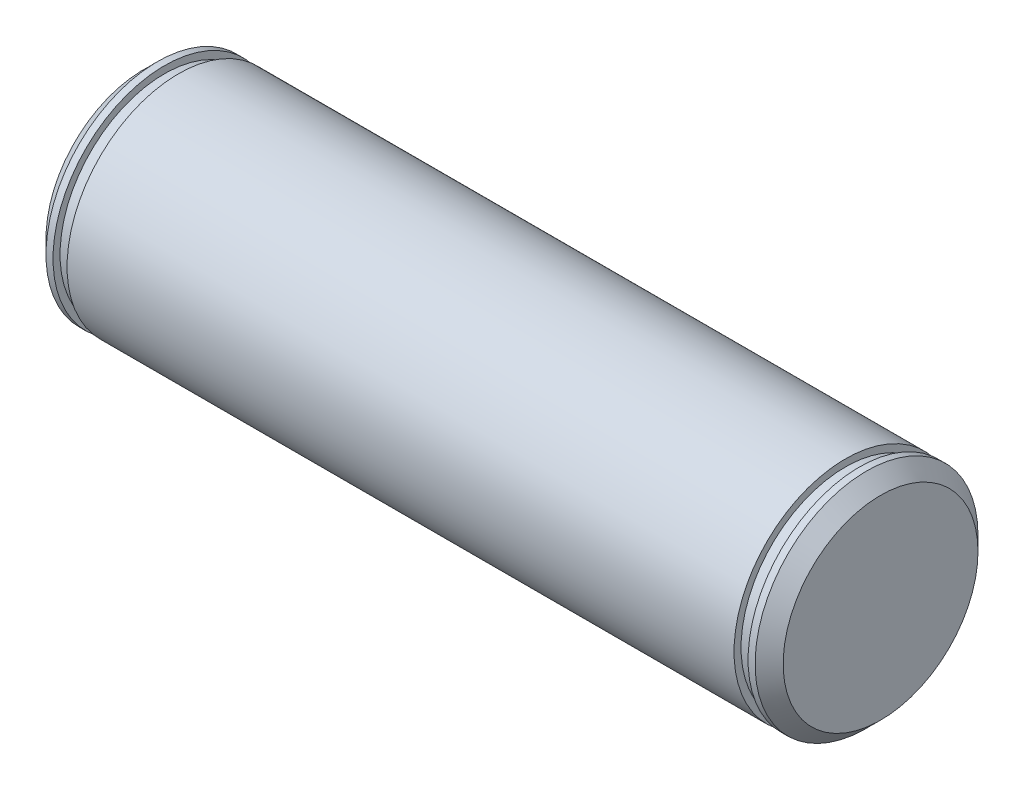
ISO-10303-21;
HEADER;
FILE_DESCRIPTION(('STEP AP214'),'2;1');
FILE_NAME('part.step','',(''),(''),'','','');
FILE_SCHEMA(('AUTOMOTIVE_DESIGN { 1 0 10303 214 1 1 1 1 }'));
ENDSEC;
DATA;
#1=APPLICATION_CONTEXT('core data for automotive mechanical design processes');
#2=APPLICATION_PROTOCOL_DEFINITION('international standard','automotive_design',2000,#1);
#3=PRODUCT_CONTEXT('',#1,'mechanical');
#4=PRODUCT('Part','Part','',(#3));
#5=PRODUCT_RELATED_PRODUCT_CATEGORY('part','',(#4));
#6=PRODUCT_DEFINITION_FORMATION('','',#4);
#7=PRODUCT_DEFINITION_CONTEXT('part definition',#1,'design');
#8=PRODUCT_DEFINITION('design','',#6,#7);
#9=PRODUCT_DEFINITION_SHAPE('','',#8);
#10=(LENGTH_UNIT() NAMED_UNIT(*) SI_UNIT(.MILLI.,.METRE.));
#11=(NAMED_UNIT(*) PLANE_ANGLE_UNIT() SI_UNIT($,.RADIAN.));
#12=(NAMED_UNIT(*) SI_UNIT($,.STERADIAN.) SOLID_ANGLE_UNIT());
#13=UNCERTAINTY_MEASURE_WITH_UNIT(LENGTH_MEASURE(1.E-05),#10,'distance_accuracy_value','');
#14=(GEOMETRIC_REPRESENTATION_CONTEXT(3) GLOBAL_UNCERTAINTY_ASSIGNED_CONTEXT((#13)) GLOBAL_UNIT_ASSIGNED_CONTEXT((#10,
#11,#12)) REPRESENTATION_CONTEXT('',''));
#15=CARTESIAN_POINT('',(0.,0.,0.));
#16=DIRECTION('',(0.,0.,1.));
#17=DIRECTION('',(1.,0.,0.));
#18=AXIS2_PLACEMENT_3D('',#15,#16,#17);
#19=CARTESIAN_POINT('',(52.5,0.,0.));
#20=DIRECTION('',(-1.,0.,0.));
#21=DIRECTION('',(0.,0.,1.));
#22=AXIS2_PLACEMENT_3D('',#19,#20,#21);
#23=CYLINDRICAL_SURFACE('',#22,15.875);
#24=CARTESIAN_POINT('',(-50.5,0.,0.));
#25=DIRECTION('',(1.,0.,0.));
#26=DIRECTION('',(0.,0.,-1.));
#27=AXIS2_PLACEMENT_3D('',#24,#25,#26);
#28=CIRCLE('',#27,15.875);
#29=CARTESIAN_POINT('',(-50.5,0.,-15.875));
#30=VERTEX_POINT('',#29);
#31=EDGE_CURVE('E45',#30,#30,#28,.T.);
#32=ORIENTED_EDGE('',*,*,#31,.T.);
#33=EDGE_LOOP('',(#32));
#34=FACE_BOUND('',#33,.T.);
#35=CARTESIAN_POINT('',(-49.5,0.,0.));
#36=DIRECTION('',(1.,0.,0.));
#37=DIRECTION('',(0.,0.,-1.));
#38=AXIS2_PLACEMENT_3D('',#35,#36,#37);
#39=CIRCLE('',#38,15.875);
#40=CARTESIAN_POINT('',(-49.5,0.,-15.875));
#41=VERTEX_POINT('',#40);
#42=EDGE_CURVE('E54',#41,#41,#39,.T.);
#43=ORIENTED_EDGE('',*,*,#42,.F.);
#44=EDGE_LOOP('',(#43));
#45=FACE_BOUND('',#44,.T.);
#46=ADVANCED_FACE('F33',(#34,#45),#23,.T.);
#47=CARTESIAN_POINT('',(-52.5,0.,0.));
#48=DIRECTION('',(1.,0.,0.));
#49=DIRECTION('',(0.,0.,-1.));
#50=AXIS2_PLACEMENT_3D('',#47,#48,#49);
#51=PLANE('',#50);
#52=CARTESIAN_POINT('',(-52.5,0.,0.));
#53=DIRECTION('',(1.,0.,0.));
#54=DIRECTION('',(0.,0.,-1.));
#55=AXIS2_PLACEMENT_3D('',#52,#53,#54);
#56=CIRCLE('',#55,13.875);
#57=CARTESIAN_POINT('',(-52.5,0.,-13.875));
#58=VERTEX_POINT('',#57);
#59=EDGE_CURVE('E41',#58,#58,#56,.F.);
#60=ORIENTED_EDGE('',*,*,#59,.T.);
#61=EDGE_LOOP('',(#60));
#62=FACE_BOUND('',#61,.T.);
#63=ADVANCED_FACE('F100',(#62),#51,.F.);
#64=CARTESIAN_POINT('',(-50.5,0.,0.));
#65=DIRECTION('',(1.,0.,0.));
#66=DIRECTION('',(0.,0.,-1.));
#67=AXIS2_PLACEMENT_3D('',#64,#65,#66);
#68=CONICAL_SURFACE('',#67,15.875,0.785398163397452);
#69=ORIENTED_EDGE('',*,*,#59,.F.);
#70=EDGE_LOOP('',(#69));
#71=FACE_BOUND('',#70,.T.);
#72=ORIENTED_EDGE('',*,*,#31,.F.);
#73=EDGE_LOOP('',(#72));
#74=FACE_BOUND('',#73,.T.);
#75=ADVANCED_FACE('F107',(#71,#74),#68,.T.);
#76=CARTESIAN_POINT('',(-49.5,0.,0.));
#77=DIRECTION('',(1.,0.,0.));
#78=DIRECTION('',(0.,0.,-1.));
#79=AXIS2_PLACEMENT_3D('',#76,#77,#78);
#80=PLANE('',#79);
#81=CARTESIAN_POINT('',(-49.5,0.,0.));
#82=DIRECTION('',(1.,0.,0.));
#83=DIRECTION('',(0.,0.,-1.));
#84=AXIS2_PLACEMENT_3D('',#81,#82,#83);
#85=CIRCLE('',#84,14.875);
#86=CARTESIAN_POINT('',(-49.5,0.,-14.875));
#87=VERTEX_POINT('',#86);
#88=EDGE_CURVE('E58',#87,#87,#85,.T.);
#89=ORIENTED_EDGE('',*,*,#88,.F.);
#90=EDGE_LOOP('',(#89));
#91=FACE_BOUND('',#90,.T.);
#92=ORIENTED_EDGE('',*,*,#42,.T.);
#93=EDGE_LOOP('',(#92));
#94=FACE_BOUND('',#93,.T.);
#95=ADVANCED_FACE('F133',(#91,#94),#80,.T.);
#96=CARTESIAN_POINT('',(-47.5,0.,0.));
#97=DIRECTION('',(1.,0.,0.));
#98=DIRECTION('',(0.,0.,-1.));
#99=AXIS2_PLACEMENT_3D('',#96,#97,#98);
#100=PLANE('',#99);
#101=CARTESIAN_POINT('',(-47.5,0.,0.));
#102=DIRECTION('',(1.,0.,0.));
#103=DIRECTION('',(0.,0.,-1.));
#104=AXIS2_PLACEMENT_3D('',#101,#102,#103);
#105=CIRCLE('',#104,14.875);
#106=CARTESIAN_POINT('',(-47.5,0.,-14.875));
#107=VERTEX_POINT('',#106);
#108=EDGE_CURVE('E61',#107,#107,#105,.T.);
#109=ORIENTED_EDGE('',*,*,#108,.T.);
#110=EDGE_LOOP('',(#109));
#111=FACE_BOUND('',#110,.T.);
#112=CARTESIAN_POINT('',(-47.5,0.,0.));
#113=DIRECTION('',(1.,0.,0.));
#114=DIRECTION('',(0.,0.,-1.));
#115=AXIS2_PLACEMENT_3D('',#112,#113,#114);
#116=CIRCLE('',#115,15.875);
#117=CARTESIAN_POINT('',(-47.5,0.,-15.875));
#118=VERTEX_POINT('',#117);
#119=EDGE_CURVE('E55',#118,#118,#116,.T.);
#120=ORIENTED_EDGE('',*,*,#119,.F.);
#121=EDGE_LOOP('',(#120));
#122=FACE_BOUND('',#121,.T.);
#123=ADVANCED_FACE('F130',(#111,#122),#100,.F.);
#124=CARTESIAN_POINT('',(-49.5,0.,0.));
#125=DIRECTION('',(1.,0.,0.));
#126=DIRECTION('',(0.,0.,-1.));
#127=AXIS2_PLACEMENT_3D('',#124,#125,#126);
#128=CYLINDRICAL_SURFACE('',#127,14.875);
#129=ORIENTED_EDGE('',*,*,#88,.T.);
#130=EDGE_LOOP('',(#129));
#131=FACE_BOUND('',#130,.T.);
#132=ORIENTED_EDGE('',*,*,#108,.F.);
#133=EDGE_LOOP('',(#132));
#134=FACE_BOUND('',#133,.T.);
#135=ADVANCED_FACE('F111',(#131,#134),#128,.T.);
#136=CARTESIAN_POINT('',(47.5,0.,0.));
#137=DIRECTION('',(1.,0.,0.));
#138=DIRECTION('',(0.,0.,-1.));
#139=AXIS2_PLACEMENT_3D('',#136,#137,#138);
#140=CIRCLE('',#139,15.875);
#141=CARTESIAN_POINT('',(47.5,0.,-15.875));
#142=VERTEX_POINT('',#141);
#143=EDGE_CURVE('E67',#142,#142,#140,.T.);
#144=ORIENTED_EDGE('',*,*,#143,.F.);
#145=EDGE_LOOP('',(#144));
#146=FACE_BOUND('',#145,.T.);
#147=ORIENTED_EDGE('',*,*,#119,.T.);
#148=EDGE_LOOP('',(#147));
#149=FACE_BOUND('',#148,.T.);
#150=ADVANCED_FACE('F95',(#146,#149),#23,.T.);
#151=CARTESIAN_POINT('',(49.5,0.,0.));
#152=DIRECTION('',(-1.,0.,0.));
#153=DIRECTION('',(0.,0.,-1.));
#154=AXIS2_PLACEMENT_3D('',#151,#152,#153);
#155=PLANE('',#154);
#156=CARTESIAN_POINT('',(49.5,0.,0.));
#157=DIRECTION('',(1.,0.,0.));
#158=DIRECTION('',(0.,0.,-1.));
#159=AXIS2_PLACEMENT_3D('',#156,#157,#158);
#160=CIRCLE('',#159,15.875);
#161=CARTESIAN_POINT('',(49.5,0.,-15.875));
#162=VERTEX_POINT('',#161);
#163=EDGE_CURVE('E64',#162,#162,#160,.T.);
#164=ORIENTED_EDGE('',*,*,#163,.F.);
#165=EDGE_LOOP('',(#164));
#166=FACE_BOUND('',#165,.T.);
#167=CARTESIAN_POINT('',(49.5,0.,0.));
#168=DIRECTION('',(1.,0.,0.));
#169=DIRECTION('',(0.,0.,-1.));
#170=AXIS2_PLACEMENT_3D('',#167,#168,#169);
#171=CIRCLE('',#170,14.875);
#172=CARTESIAN_POINT('',(49.5,0.,-14.875));
#173=VERTEX_POINT('',#172);
#174=EDGE_CURVE('E70',#173,#173,#171,.T.);
#175=ORIENTED_EDGE('',*,*,#174,.T.);
#176=EDGE_LOOP('',(#175));
#177=FACE_BOUND('',#176,.T.);
#178=ADVANCED_FACE('F79',(#166,#177),#155,.T.);
#179=CARTESIAN_POINT('',(47.5,0.,0.));
#180=DIRECTION('',(-1.,0.,0.));
#181=DIRECTION('',(0.,0.,-1.));
#182=AXIS2_PLACEMENT_3D('',#179,#180,#181);
#183=PLANE('',#182);
#184=ORIENTED_EDGE('',*,*,#143,.T.);
#185=EDGE_LOOP('',(#184));
#186=FACE_BOUND('',#185,.T.);
#187=CARTESIAN_POINT('',(47.5,0.,0.));
#188=DIRECTION('',(1.,0.,0.));
#189=DIRECTION('',(0.,0.,-1.));
#190=AXIS2_PLACEMENT_3D('',#187,#188,#189);
#191=CIRCLE('',#190,14.875);
#192=CARTESIAN_POINT('',(47.5,0.,-14.875));
#193=VERTEX_POINT('',#192);
#194=EDGE_CURVE('E73',#193,#193,#191,.T.);
#195=ORIENTED_EDGE('',*,*,#194,.F.);
#196=EDGE_LOOP('',(#195));
#197=FACE_BOUND('',#196,.T.);
#198=ADVANCED_FACE('F85',(#186,#197),#183,.F.);
#199=CARTESIAN_POINT('',(49.5,0.,0.));
#200=DIRECTION('',(-1.,0.,0.));
#201=DIRECTION('',(0.,0.,1.));
#202=AXIS2_PLACEMENT_3D('',#199,#200,#201);
#203=CYLINDRICAL_SURFACE('',#202,14.875);
#204=ORIENTED_EDGE('',*,*,#174,.F.);
#205=EDGE_LOOP('',(#204));
#206=FACE_BOUND('',#205,.T.);
#207=ORIENTED_EDGE('',*,*,#194,.T.);
#208=EDGE_LOOP('',(#207));
#209=FACE_BOUND('',#208,.T.);
#210=ADVANCED_FACE('F81',(#206,#209),#203,.T.);
#211=CARTESIAN_POINT('',(52.5,0.,0.));
#212=DIRECTION('',(1.,0.,0.));
#213=DIRECTION('',(0.,0.,-1.));
#214=AXIS2_PLACEMENT_3D('',#211,#212,#213);
#215=PLANE('',#214);
#216=CARTESIAN_POINT('',(52.5,0.,0.));
#217=DIRECTION('',(1.,0.,0.));
#218=DIRECTION('',(0.,0.,-1.));
#219=AXIS2_PLACEMENT_3D('',#216,#217,#218);
#220=CIRCLE('',#219,13.875);
#221=CARTESIAN_POINT('',(52.5,0.,-13.875));
#222=VERTEX_POINT('',#221);
#223=EDGE_CURVE('E10',#222,#222,#220,.T.);
#224=ORIENTED_EDGE('',*,*,#223,.T.);
#225=EDGE_LOOP('',(#224));
#226=FACE_BOUND('',#225,.T.);
#227=ADVANCED_FACE('F84',(#226),#215,.T.);
#228=CARTESIAN_POINT('',(52.5,0.,0.));
#229=DIRECTION('',(-1.,0.,0.));
#230=DIRECTION('',(0.,0.,1.));
#231=AXIS2_PLACEMENT_3D('',#228,#229,#230);
#232=CONICAL_SURFACE('',#231,13.875,0.785398163397443);
#233=CARTESIAN_POINT('',(50.5,0.,0.));
#234=DIRECTION('',(1.,0.,0.));
#235=DIRECTION('',(0.,0.,-1.));
#236=AXIS2_PLACEMENT_3D('',#233,#234,#235);
#237=CIRCLE('',#236,15.875);
#238=CARTESIAN_POINT('',(50.5,0.,-15.875));
#239=VERTEX_POINT('',#238);
#240=EDGE_CURVE('E49',#239,#239,#237,.F.);
#241=ORIENTED_EDGE('',*,*,#240,.F.);
#242=EDGE_LOOP('',(#241));
#243=FACE_BOUND('',#242,.T.);
#244=ORIENTED_EDGE('',*,*,#223,.F.);
#245=EDGE_LOOP('',(#244));
#246=FACE_BOUND('',#245,.T.);
#247=ADVANCED_FACE('F36',(#243,#246),#232,.T.);
#248=ORIENTED_EDGE('',*,*,#240,.T.);
#249=EDGE_LOOP('',(#248));
#250=FACE_BOUND('',#249,.T.);
#251=ORIENTED_EDGE('',*,*,#163,.T.);
#252=EDGE_LOOP('',(#251));
#253=FACE_BOUND('',#252,.T.);
#254=ADVANCED_FACE('F103',(#250,#253),#23,.T.);
#255=CLOSED_SHELL('',(#46,#63,#75,#95,#123,#135,#150,#178,#198,#210,#227,#247,#254));
#256=MANIFOLD_SOLID_BREP('B2',#255);
#257=ADVANCED_BREP_SHAPE_REPRESENTATION('',(#18,#256),#14);
#258=SHAPE_DEFINITION_REPRESENTATION(#9,#257);
ENDSEC;
END-ISO-10303-21;
